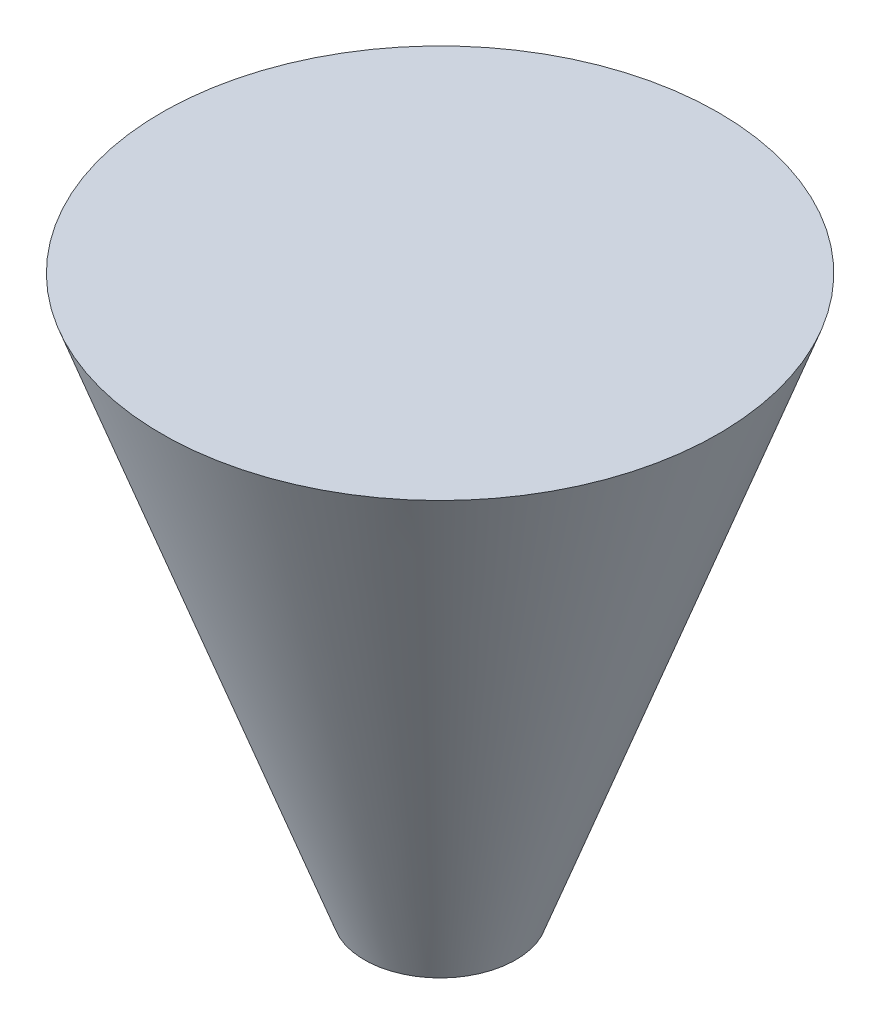
ISO-10303-21;
HEADER;
FILE_DESCRIPTION(('STEP AP214'),'2;1');
FILE_NAME('part.step','',(''),(''),'','','');
FILE_SCHEMA(('AUTOMOTIVE_DESIGN { 1 0 10303 214 1 1 1 1 }'));
ENDSEC;
DATA;
#1=APPLICATION_CONTEXT('core data for automotive mechanical design processes');
#2=APPLICATION_PROTOCOL_DEFINITION('international standard','automotive_design',2000,#1);
#3=PRODUCT_CONTEXT('',#1,'mechanical');
#4=PRODUCT('Part','Part','',(#3));
#5=PRODUCT_RELATED_PRODUCT_CATEGORY('part','',(#4));
#6=PRODUCT_DEFINITION_FORMATION('','',#4);
#7=PRODUCT_DEFINITION_CONTEXT('part definition',#1,'design');
#8=PRODUCT_DEFINITION('design','',#6,#7);
#9=PRODUCT_DEFINITION_SHAPE('','',#8);
#10=(LENGTH_UNIT() NAMED_UNIT(*) SI_UNIT(.MILLI.,.METRE.));
#11=(NAMED_UNIT(*) PLANE_ANGLE_UNIT() SI_UNIT($,.RADIAN.));
#12=(NAMED_UNIT(*) SI_UNIT($,.STERADIAN.) SOLID_ANGLE_UNIT());
#13=UNCERTAINTY_MEASURE_WITH_UNIT(LENGTH_MEASURE(1.E-05),#10,'distance_accuracy_value','');
#14=(GEOMETRIC_REPRESENTATION_CONTEXT(3) GLOBAL_UNCERTAINTY_ASSIGNED_CONTEXT((#13)) GLOBAL_UNIT_ASSIGNED_CONTEXT((#10,
#11,#12)) REPRESENTATION_CONTEXT('',''));
#15=CARTESIAN_POINT('',(0.,0.,0.));
#16=DIRECTION('',(0.,0.,1.));
#17=DIRECTION('',(1.,0.,0.));
#18=AXIS2_PLACEMENT_3D('',#15,#16,#17);
#19=CARTESIAN_POINT('',(0.,0.,0.));
#20=DIRECTION('',(0.,1.,0.));
#21=DIRECTION('',(0.,0.,-1.));
#22=AXIS2_PLACEMENT_3D('',#19,#20,#21);
#23=CONICAL_SURFACE('',#22,1.5,0.349065850398867);
#24=CARTESIAN_POINT('',(0.,-3.,0.));
#25=DIRECTION('',(0.,-1.,0.));
#26=DIRECTION('',(0.,0.,-1.));
#27=AXIS2_PLACEMENT_3D('',#24,#25,#26);
#28=CIRCLE('',#27,0.40808929720139);
#29=CARTESIAN_POINT('',(0.,-3.,-0.40808929720139));
#30=VERTEX_POINT('',#29);
#31=EDGE_CURVE('E10',#30,#30,#28,.T.);
#32=CARTESIAN_POINT('',(0.,0.,0.));
#33=DIRECTION('',(0.,-1.,0.));
#34=DIRECTION('',(0.,0.,-1.));
#35=AXIS2_PLACEMENT_3D('',#32,#33,#34);
#36=CIRCLE('',#35,1.5);
#37=CARTESIAN_POINT('',(0.,0.,-1.5));
#38=VERTEX_POINT('',#37);
#39=EDGE_CURVE('E37',#38,#38,#36,.T.);
#40=CARTESIAN_POINT('',(0.,-3.,-0.40808929720139));
#41=CARTESIAN_POINT('',(0.,-2.96875,-0.419463367022209));
#42=CARTESIAN_POINT('',(0.,-2.9375,-0.430837436843027));
#43=CARTESIAN_POINT('',(0.,-2.875,-0.453585576484665));
#44=CARTESIAN_POINT('',(0.,-2.84375,-0.464959646305484));
#45=CARTESIAN_POINT('',(0.,-2.78125,-0.487707785947122));
#46=CARTESIAN_POINT('',(0.,-2.75,-0.499081855767941));
#47=CARTESIAN_POINT('',(0.,-2.6875,-0.521829995409578));
#48=CARTESIAN_POINT('',(0.,-2.65625,-0.533204065230397));
#49=CARTESIAN_POINT('',(0.,-2.59375,-0.555952204872035));
#50=CARTESIAN_POINT('',(0.,-2.5625,-0.567326274692854));
#51=CARTESIAN_POINT('',(0.,-2.5,-0.590074414334491));
#52=CARTESIAN_POINT('',(0.,-2.46875,-0.60144848415531));
#53=CARTESIAN_POINT('',(0.,-2.40625,-0.624196623796948));
#54=CARTESIAN_POINT('',(0.,-2.375,-0.635570693617767));
#55=CARTESIAN_POINT('',(0.,-2.3125,-0.658318833259405));
#56=CARTESIAN_POINT('',(0.,-2.28125,-0.669692903080223));
#57=CARTESIAN_POINT('',(0.,-2.21875,-0.692441042721861));
#58=CARTESIAN_POINT('',(0.,-2.1875,-0.70381511254268));
#59=CARTESIAN_POINT('',(0.,-2.125,-0.726563252184318));
#60=CARTESIAN_POINT('',(0.,-2.09375,-0.737937322005137));
#61=CARTESIAN_POINT('',(0.,-2.03125,-0.760685461646774));
#62=CARTESIAN_POINT('',(0.,-2.,-0.772059531467593));
#63=CARTESIAN_POINT('',(0.,-1.9375,-0.794807671109231));
#64=CARTESIAN_POINT('',(0.,-1.90625,-0.80618174093005));
#65=CARTESIAN_POINT('',(0.,-1.84375,-0.828929880571687));
#66=CARTESIAN_POINT('',(0.,-1.8125,-0.840303950392506));
#67=CARTESIAN_POINT('',(0.,-1.75,-0.863052090034144));
#68=CARTESIAN_POINT('',(0.,-1.71875,-0.874426159854963));
#69=CARTESIAN_POINT('',(0.,-1.65625,-0.8971742994966));
#70=CARTESIAN_POINT('',(0.,-1.625,-0.908548369317419));
#71=CARTESIAN_POINT('',(0.,-1.5625,-0.931296508959057));
#72=CARTESIAN_POINT('',(0.,-1.53125,-0.942670578779876));
#73=CARTESIAN_POINT('',(0.,-1.46875,-0.965418718421514));
#74=CARTESIAN_POINT('',(0.,-1.4375,-0.976792788242333));
#75=CARTESIAN_POINT('',(0.,-1.375,-0.99954092788397));
#76=CARTESIAN_POINT('',(0.,-1.34375,-1.01091499770479));
#77=CARTESIAN_POINT('',(0.,-1.28125,-1.03366313734643));
#78=CARTESIAN_POINT('',(0.,-1.25,-1.04503720716725));
#79=CARTESIAN_POINT('',(0.,-1.1875,-1.06778534680888));
#80=CARTESIAN_POINT('',(0.,-1.15625,-1.0791594166297));
#81=CARTESIAN_POINT('',(0.,-1.09375,-1.10190755627134));
#82=CARTESIAN_POINT('',(0.,-1.0625,-1.11328162609216));
#83=CARTESIAN_POINT('',(0.,-1.,-1.1360297657338));
#84=CARTESIAN_POINT('',(0.,-0.96875,-1.14740383555462));
#85=CARTESIAN_POINT('',(0.,-0.90625,-1.17015197519625));
#86=CARTESIAN_POINT('',(0.,-0.875,-1.18152604501707));
#87=CARTESIAN_POINT('',(0.,-0.8125,-1.20427418465871));
#88=CARTESIAN_POINT('',(0.,-0.78125,-1.21564825447953));
#89=CARTESIAN_POINT('',(0.,-0.71875,-1.23839639412117));
#90=CARTESIAN_POINT('',(0.,-0.6875,-1.24977046394198));
#91=CARTESIAN_POINT('',(0.,-0.625,-1.27251860358362));
#92=CARTESIAN_POINT('',(0.,-0.59375,-1.28389267340444));
#93=CARTESIAN_POINT('',(0.,-0.53125,-1.30664081304608));
#94=CARTESIAN_POINT('',(0.,-0.5,-1.3180148828669));
#95=CARTESIAN_POINT('',(0.,-0.4375,-1.34076302250854));
#96=CARTESIAN_POINT('',(0.,-0.40625,-1.35213709232935));
#97=CARTESIAN_POINT('',(0.,-0.34375,-1.37488523197099));
#98=CARTESIAN_POINT('',(0.,-0.3125,-1.38625930179181));
#99=CARTESIAN_POINT('',(0.,-0.25,-1.40900744143345));
#100=CARTESIAN_POINT('',(0.,-0.21875,-1.42038151125427));
#101=CARTESIAN_POINT('',(0.,-0.15625,-1.44312965089591));
#102=CARTESIAN_POINT('',(0.,-0.125,-1.45450372071672));
#103=CARTESIAN_POINT('',(0.,-0.0625000000000001,-1.47725186035836));
#104=CARTESIAN_POINT('',(0.,-0.03125,-1.48862593017918));
#105=CARTESIAN_POINT('',(0.,0.,-1.5));
#106=B_SPLINE_CURVE_WITH_KNOTS('',3,(#40,#41,#42,#43,#44,#45,#46,#47,#48,#49,#50,#51,#52,#53,
#54,#55,#56,#57,#58,#59,#60,#61,#62,#63,#64,#65,#66,#67,#68,#69,#70,#71,#72,#73,#74,#75,#76,#77,
#78,#79,#80,#81,#82,#83,#84,#85,#86,#87,#88,#89,#90,#91,#92,#93,#94,#95,#96,#97,#98,#99,#100,
#101,#102,#103,#104,#105),.UNSPECIFIED.,.F.,.F.,(4,2,2,2,2,2,2,2,2,2,2,2,2,2,2,2,2,2,2,2,2,2,2,
2,2,2,2,2,2,2,2,2,4),(0.,0.0997666661696168,0.199533332339234,0.299299998508851,
0.399066664678467,0.498833330848084,0.598599997017701,0.698366663187318,0.798133329356934,
0.897899995526551,0.997666661696168,1.09743332786578,1.1971999940354,1.29696666020502,
1.39673332637464,1.49649999254425,1.59626665871387,1.69603332488349,1.7957999910531,
1.89556665722272,1.99533332339234,2.09509998956195,2.19486665573157,2.29463332190119,
2.3943999880708,2.49416665424042,2.59393332041004,2.69369998657965,2.79346665274927,
2.89323331891889,2.9929999850885,3.09276665125812,3.19253331742774),.UNSPECIFIED.);
#107=EDGE_CURVE('BSEAM31',#30,#38,#106,.T.);
#108=ORIENTED_EDGE('',*,*,#31,.F.);
#109=ORIENTED_EDGE('',*,*,#39,.T.);
#110=ORIENTED_EDGE('',*,*,#107,.T.);
#111=ORIENTED_EDGE('',*,*,#107,.F.);
#112=EDGE_LOOP('',(#108,#110,#109,#111));
#113=FACE_BOUND('',#112,.T.);
#114=ADVANCED_FACE('F31',(#113),#23,.T.);
#115=CARTESIAN_POINT('',(0.,-3.,0.));
#116=DIRECTION('',(0.,-1.,0.));
#117=DIRECTION('',(0.,0.,-1.));
#118=AXIS2_PLACEMENT_3D('',#115,#116,#117);
#119=PLANE('',#118);
#120=ORIENTED_EDGE('',*,*,#31,.T.);
#121=EDGE_LOOP('',(#120));
#122=FACE_BOUND('',#121,.T.);
#123=ADVANCED_FACE('F46',(#122),#119,.T.);
#124=CARTESIAN_POINT('',(-101.845255910092,0.,60.));
#125=DIRECTION('',(0.,-1.,0.));
#126=DIRECTION('',(0.,0.,-1.));
#127=AXIS2_PLACEMENT_3D('',#124,#125,#126);
#128=PLANE('',#127);
#129=ORIENTED_EDGE('',*,*,#39,.F.);
#130=EDGE_LOOP('',(#129));
#131=FACE_BOUND('',#130,.T.);
#132=ADVANCED_FACE('F44',(#131),#128,.F.);
#133=CLOSED_SHELL('',(#114,#123,#132));
#134=MANIFOLD_SOLID_BREP('B2',#133);
#135=ADVANCED_BREP_SHAPE_REPRESENTATION('',(#18,#134),#14);
#136=SHAPE_DEFINITION_REPRESENTATION(#9,#135);
ENDSEC;
END-ISO-10303-21;
